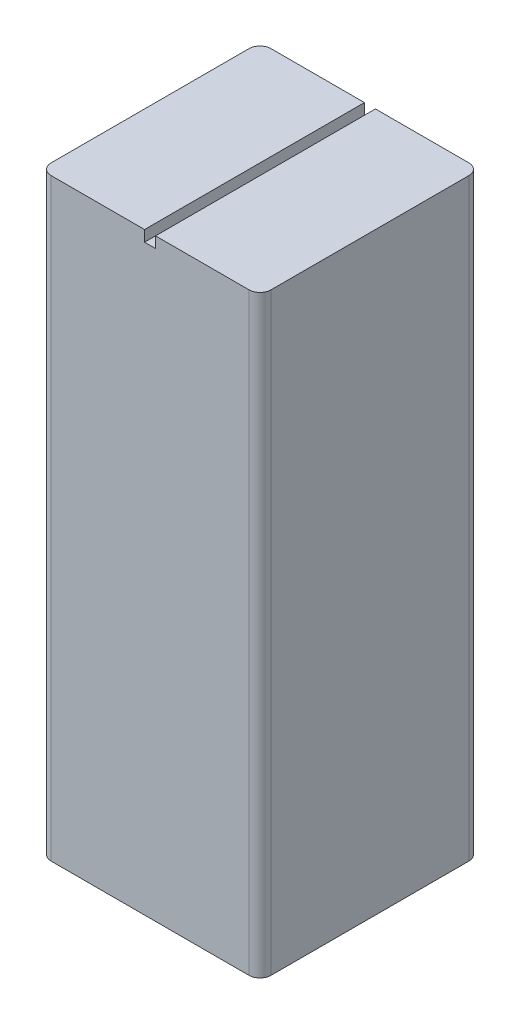
ISO-10303-21;
HEADER;
FILE_DESCRIPTION(('STEP AP214'),'2;1');
FILE_NAME('part.step','',(''),(''),'','','');
FILE_SCHEMA(('AUTOMOTIVE_DESIGN { 1 0 10303 214 1 1 1 1 }'));
ENDSEC;
DATA;
#1=APPLICATION_CONTEXT('core data for automotive mechanical design processes');
#2=APPLICATION_PROTOCOL_DEFINITION('international standard','automotive_design',2000,#1);
#3=PRODUCT_CONTEXT('',#1,'mechanical');
#4=PRODUCT('Part','Part','',(#3));
#5=PRODUCT_RELATED_PRODUCT_CATEGORY('part','',(#4));
#6=PRODUCT_DEFINITION_FORMATION('','',#4);
#7=PRODUCT_DEFINITION_CONTEXT('part definition',#1,'design');
#8=PRODUCT_DEFINITION('design','',#6,#7);
#9=PRODUCT_DEFINITION_SHAPE('','',#8);
#10=(LENGTH_UNIT() NAMED_UNIT(*) SI_UNIT(.MILLI.,.METRE.));
#11=(NAMED_UNIT(*) PLANE_ANGLE_UNIT() SI_UNIT($,.RADIAN.));
#12=(NAMED_UNIT(*) SI_UNIT($,.STERADIAN.) SOLID_ANGLE_UNIT());
#13=UNCERTAINTY_MEASURE_WITH_UNIT(LENGTH_MEASURE(1.E-05),#10,'distance_accuracy_value','');
#14=(GEOMETRIC_REPRESENTATION_CONTEXT(3) GLOBAL_UNCERTAINTY_ASSIGNED_CONTEXT((#13)) GLOBAL_UNIT_ASSIGNED_CONTEXT((#10,
#11,#12)) REPRESENTATION_CONTEXT('',''));
#15=CARTESIAN_POINT('',(0.,0.,0.));
#16=DIRECTION('',(0.,0.,1.));
#17=DIRECTION('',(1.,0.,0.));
#18=AXIS2_PLACEMENT_3D('',#15,#16,#17);
#19=CARTESIAN_POINT('',(0.,54.,0.));
#20=DIRECTION('',(0.,-1.,0.));
#21=DIRECTION('',(0.,0.,-1.));
#22=AXIS2_PLACEMENT_3D('',#19,#20,#21);
#23=PLANE('',#22);
#24=DIRECTION('',(1.,0.,0.));
#25=VECTOR('',#24,1.);
#26=CARTESIAN_POINT('',(0.,54.,0.));
#27=LINE('',#26,#25);
#28=CARTESIAN_POINT('',(1.,54.,0.));
#29=VERTEX_POINT('',#28);
#30=CARTESIAN_POINT('',(9.5,54.,0.));
#31=VERTEX_POINT('',#30);
#32=EDGE_CURVE('E170',#29,#31,#27,.T.);
#33=ORIENTED_EDGE('',*,*,#32,.T.);
#34=DIRECTION('',(0.,0.,1.));
#35=VECTOR('',#34,1.);
#36=CARTESIAN_POINT('',(9.5,54.,-20.));
#37=LINE('',#36,#35);
#38=CARTESIAN_POINT('',(9.5,54.,-20.));
#39=VERTEX_POINT('',#38);
#40=EDGE_CURVE('E133',#39,#31,#37,.T.);
#41=ORIENTED_EDGE('',*,*,#40,.F.);
#42=DIRECTION('',(-1.,0.,0.));
#43=VECTOR('',#42,1.);
#44=CARTESIAN_POINT('',(0.,54.,-20.));
#45=LINE('',#44,#43);
#46=CARTESIAN_POINT('',(0.999999999999997,54.,-20.));
#47=VERTEX_POINT('',#46);
#48=EDGE_CURVE('E62',#39,#47,#45,.T.);
#49=ORIENTED_EDGE('',*,*,#48,.T.);
#50=CARTESIAN_POINT('',(0.999999999999997,54.,-19.));
#51=DIRECTION('',(0.,-1.,0.));
#52=DIRECTION('',(0.,0.,-1.));
#53=AXIS2_PLACEMENT_3D('',#50,#51,#52);
#54=CIRCLE('',#53,1.);
#55=CARTESIAN_POINT('',(0.,54.,-19.));
#56=VERTEX_POINT('',#55);
#57=EDGE_CURVE('E207',#47,#56,#54,.F.);
#58=ORIENTED_EDGE('',*,*,#57,.T.);
#59=DIRECTION('',(0.,0.,1.));
#60=VECTOR('',#59,1.);
#61=CARTESIAN_POINT('',(0.,54.,0.));
#62=LINE('',#61,#60);
#63=CARTESIAN_POINT('',(0.,54.,-1.));
#64=VERTEX_POINT('',#63);
#65=EDGE_CURVE('E165',#56,#64,#62,.T.);
#66=ORIENTED_EDGE('',*,*,#65,.T.);
#67=CARTESIAN_POINT('',(1.,54.,-1.));
#68=DIRECTION('',(0.,-1.,0.));
#69=DIRECTION('',(0.,0.,-1.));
#70=AXIS2_PLACEMENT_3D('',#67,#68,#69);
#71=CIRCLE('',#70,1.);
#72=EDGE_CURVE('E211',#64,#29,#71,.F.);
#73=ORIENTED_EDGE('',*,*,#72,.T.);
#74=EDGE_LOOP('',(#33,#41,#49,#58,#66,#73));
#75=FACE_BOUND('',#74,.T.);
#76=ADVANCED_FACE('F39',(#75),#23,.F.);
#77=CARTESIAN_POINT('',(0.,54.,0.));
#78=DIRECTION('',(1.,0.,0.));
#79=DIRECTION('',(0.,0.,-1.));
#80=AXIS2_PLACEMENT_3D('',#77,#78,#79);
#81=PLANE('',#80);
#82=DIRECTION('',(0.,0.,1.));
#83=VECTOR('',#82,1.);
#84=CARTESIAN_POINT('',(0.,0.,0.));
#85=LINE('',#84,#83);
#86=CARTESIAN_POINT('',(0.,0.,-19.));
#87=VERTEX_POINT('',#86);
#88=CARTESIAN_POINT('',(0.,0.,-1.));
#89=VERTEX_POINT('',#88);
#90=EDGE_CURVE('E160',#87,#89,#85,.T.);
#91=ORIENTED_EDGE('',*,*,#90,.T.);
#92=DIRECTION('',(0.,-1.,0.));
#93=VECTOR('',#92,1.);
#94=CARTESIAN_POINT('',(0.,54.,-1.));
#95=LINE('',#94,#93);
#96=EDGE_CURVE('E218',#89,#64,#95,.F.);
#97=ORIENTED_EDGE('',*,*,#96,.T.);
#98=ORIENTED_EDGE('',*,*,#65,.F.);
#99=DIRECTION('',(0.,-1.,0.));
#100=VECTOR('',#99,1.);
#101=CARTESIAN_POINT('',(0.,54.,-19.));
#102=LINE('',#101,#100);
#103=EDGE_CURVE('E215',#56,#87,#102,.T.);
#104=ORIENTED_EDGE('',*,*,#103,.T.);
#105=EDGE_LOOP('',(#91,#97,#98,#104));
#106=FACE_BOUND('',#105,.T.);
#107=ADVANCED_FACE('F229',(#106),#81,.F.);
#108=CARTESIAN_POINT('',(0.,54.,0.));
#109=DIRECTION('',(0.,0.,-1.));
#110=DIRECTION('',(-1.,0.,0.));
#111=AXIS2_PLACEMENT_3D('',#108,#109,#110);
#112=PLANE('',#111);
#113=DIRECTION('',(1.,0.,0.));
#114=VECTOR('',#113,1.);
#115=CARTESIAN_POINT('',(9.5,53.,0.));
#116=LINE('',#115,#114);
#117=CARTESIAN_POINT('',(9.5,53.,0.));
#118=VERTEX_POINT('',#117);
#119=CARTESIAN_POINT('',(10.5,53.,0.));
#120=VERTEX_POINT('',#119);
#121=EDGE_CURVE('E144',#118,#120,#116,.T.);
#122=ORIENTED_EDGE('',*,*,#121,.F.);
#123=DIRECTION('',(0.,1.,0.));
#124=VECTOR('',#123,1.);
#125=CARTESIAN_POINT('',(9.5,53.,0.));
#126=LINE('',#125,#124);
#127=EDGE_CURVE('E128',#118,#31,#126,.T.);
#128=ORIENTED_EDGE('',*,*,#127,.T.);
#129=ORIENTED_EDGE('',*,*,#32,.F.);
#130=DIRECTION('',(0.,-1.,0.));
#131=VECTOR('',#130,1.);
#132=CARTESIAN_POINT('',(1.,54.,0.));
#133=LINE('',#132,#131);
#134=CARTESIAN_POINT('',(1.,0.,0.));
#135=VERTEX_POINT('',#134);
#136=EDGE_CURVE('E201',#29,#135,#133,.T.);
#137=ORIENTED_EDGE('',*,*,#136,.T.);
#138=DIRECTION('',(1.,0.,0.));
#139=VECTOR('',#138,1.);
#140=CARTESIAN_POINT('',(0.,0.,0.));
#141=LINE('',#140,#139);
#142=CARTESIAN_POINT('',(19.,0.,0.));
#143=VERTEX_POINT('',#142);
#144=EDGE_CURVE('E181',#135,#143,#141,.T.);
#145=ORIENTED_EDGE('',*,*,#144,.T.);
#146=DIRECTION('',(0.,-1.,0.));
#147=VECTOR('',#146,1.);
#148=CARTESIAN_POINT('',(19.,54.,0.));
#149=LINE('',#148,#147);
#150=CARTESIAN_POINT('',(19.,54.,0.));
#151=VERTEX_POINT('',#150);
#152=EDGE_CURVE('E204',#143,#151,#149,.F.);
#153=ORIENTED_EDGE('',*,*,#152,.T.);
#154=CARTESIAN_POINT('',(10.5,54.,0.));
#155=VERTEX_POINT('',#154);
#156=EDGE_CURVE('E168',#155,#151,#27,.T.);
#157=ORIENTED_EDGE('',*,*,#156,.F.);
#158=DIRECTION('',(0.,1.,0.));
#159=VECTOR('',#158,1.);
#160=CARTESIAN_POINT('',(10.5,53.,0.));
#161=LINE('',#160,#159);
#162=EDGE_CURVE('E54',#120,#155,#161,.T.);
#163=ORIENTED_EDGE('',*,*,#162,.F.);
#164=EDGE_LOOP('',(#122,#128,#129,#137,#145,#153,#157,#163));
#165=FACE_BOUND('',#164,.T.);
#166=ADVANCED_FACE('F149',(#165),#112,.F.);
#167=CARTESIAN_POINT('',(20.,54.,0.));
#168=DIRECTION('',(-1.,0.,0.));
#169=DIRECTION('',(0.,0.,1.));
#170=AXIS2_PLACEMENT_3D('',#167,#168,#169);
#171=PLANE('',#170);
#172=DIRECTION('',(0.,0.,-1.));
#173=VECTOR('',#172,1.);
#174=CARTESIAN_POINT('',(20.,54.,0.));
#175=LINE('',#174,#173);
#176=CARTESIAN_POINT('',(20.,54.,-1.));
#177=VERTEX_POINT('',#176);
#178=CARTESIAN_POINT('',(20.,54.,-19.));
#179=VERTEX_POINT('',#178);
#180=EDGE_CURVE('E172',#177,#179,#175,.T.);
#181=ORIENTED_EDGE('',*,*,#180,.F.);
#182=DIRECTION('',(0.,-1.,0.));
#183=VECTOR('',#182,1.);
#184=CARTESIAN_POINT('',(20.,54.,-1.));
#185=LINE('',#184,#183);
#186=CARTESIAN_POINT('',(20.,0.,-1.));
#187=VERTEX_POINT('',#186);
#188=EDGE_CURVE('E190',#177,#187,#185,.T.);
#189=ORIENTED_EDGE('',*,*,#188,.T.);
#190=DIRECTION('',(0.,0.,-1.));
#191=VECTOR('',#190,1.);
#192=CARTESIAN_POINT('',(20.,0.,0.));
#193=LINE('',#192,#191);
#194=CARTESIAN_POINT('',(20.,0.,-19.));
#195=VERTEX_POINT('',#194);
#196=EDGE_CURVE('E184',#187,#195,#193,.T.);
#197=ORIENTED_EDGE('',*,*,#196,.T.);
#198=DIRECTION('',(0.,-1.,0.));
#199=VECTOR('',#198,1.);
#200=CARTESIAN_POINT('',(20.,54.,-19.));
#201=LINE('',#200,#199);
#202=EDGE_CURVE('E178',#195,#179,#201,.F.);
#203=ORIENTED_EDGE('',*,*,#202,.T.);
#204=EDGE_LOOP('',(#181,#189,#197,#203));
#205=FACE_BOUND('',#204,.T.);
#206=ADVANCED_FACE('F246',(#205),#171,.F.);
#207=CARTESIAN_POINT('',(0.,54.,-20.));
#208=DIRECTION('',(0.,0.,1.));
#209=DIRECTION('',(1.,0.,0.));
#210=AXIS2_PLACEMENT_3D('',#207,#208,#209);
#211=PLANE('',#210);
#212=ORIENTED_EDGE('',*,*,#48,.F.);
#213=DIRECTION('',(0.,1.,0.));
#214=VECTOR('',#213,1.);
#215=CARTESIAN_POINT('',(9.5,53.,-20.));
#216=LINE('',#215,#214);
#217=CARTESIAN_POINT('',(9.5,53.,-20.));
#218=VERTEX_POINT('',#217);
#219=EDGE_CURVE('E158',#218,#39,#216,.T.);
#220=ORIENTED_EDGE('',*,*,#219,.F.);
#221=DIRECTION('',(-1.,0.,0.));
#222=VECTOR('',#221,1.);
#223=CARTESIAN_POINT('',(9.5,53.,-20.));
#224=LINE('',#223,#222);
#225=CARTESIAN_POINT('',(10.5,53.,-20.));
#226=VERTEX_POINT('',#225);
#227=EDGE_CURVE('E138',#226,#218,#224,.T.);
#228=ORIENTED_EDGE('',*,*,#227,.F.);
#229=DIRECTION('',(0.,1.,0.));
#230=VECTOR('',#229,1.);
#231=CARTESIAN_POINT('',(10.5,53.,-20.));
#232=LINE('',#231,#230);
#233=CARTESIAN_POINT('',(10.5,54.,-20.));
#234=VERTEX_POINT('',#233);
#235=EDGE_CURVE('E161',#226,#234,#232,.T.);
#236=ORIENTED_EDGE('',*,*,#235,.T.);
#237=CARTESIAN_POINT('',(19.,54.,-20.));
#238=VERTEX_POINT('',#237);
#239=EDGE_CURVE('E175',#238,#234,#45,.T.);
#240=ORIENTED_EDGE('',*,*,#239,.F.);
#241=DIRECTION('',(0.,-1.,0.));
#242=VECTOR('',#241,1.);
#243=CARTESIAN_POINT('',(19.,54.,-20.));
#244=LINE('',#243,#242);
#245=CARTESIAN_POINT('',(19.,0.,-20.));
#246=VERTEX_POINT('',#245);
#247=EDGE_CURVE('E11',#238,#246,#244,.T.);
#248=ORIENTED_EDGE('',*,*,#247,.T.);
#249=DIRECTION('',(-1.,0.,0.));
#250=VECTOR('',#249,1.);
#251=CARTESIAN_POINT('',(0.,0.,-20.));
#252=LINE('',#251,#250);
#253=CARTESIAN_POINT('',(0.999999999999997,0.,-20.));
#254=VERTEX_POINT('',#253);
#255=EDGE_CURVE('E169',#246,#254,#252,.T.);
#256=ORIENTED_EDGE('',*,*,#255,.T.);
#257=DIRECTION('',(0.,-1.,0.));
#258=VECTOR('',#257,1.);
#259=CARTESIAN_POINT('',(0.999999999999997,54.,-20.));
#260=LINE('',#259,#258);
#261=EDGE_CURVE('E47',#254,#47,#260,.F.);
#262=ORIENTED_EDGE('',*,*,#261,.T.);
#263=EDGE_LOOP('',(#212,#220,#228,#236,#240,#248,#256,#262));
#264=FACE_BOUND('',#263,.T.);
#265=ADVANCED_FACE('F222',(#264),#211,.F.);
#266=ORIENTED_EDGE('',*,*,#239,.T.);
#267=DIRECTION('',(0.,0.,-1.));
#268=VECTOR('',#267,1.);
#269=CARTESIAN_POINT('',(10.5,54.,-20.));
#270=LINE('',#269,#268);
#271=EDGE_CURVE('E147',#155,#234,#270,.T.);
#272=ORIENTED_EDGE('',*,*,#271,.F.);
#273=ORIENTED_EDGE('',*,*,#156,.T.);
#274=CARTESIAN_POINT('',(19.,54.,-1.));
#275=DIRECTION('',(0.,-1.,0.));
#276=DIRECTION('',(0.,0.,-1.));
#277=AXIS2_PLACEMENT_3D('',#274,#275,#276);
#278=CIRCLE('',#277,1.);
#279=EDGE_CURVE('E213',#151,#177,#278,.F.);
#280=ORIENTED_EDGE('',*,*,#279,.T.);
#281=ORIENTED_EDGE('',*,*,#180,.T.);
#282=CARTESIAN_POINT('',(19.,54.,-19.));
#283=DIRECTION('',(0.,-1.,0.));
#284=DIRECTION('',(0.,0.,-1.));
#285=AXIS2_PLACEMENT_3D('',#282,#283,#284);
#286=CIRCLE('',#285,1.);
#287=EDGE_CURVE('E209',#179,#238,#286,.F.);
#288=ORIENTED_EDGE('',*,*,#287,.T.);
#289=EDGE_LOOP('',(#266,#272,#273,#280,#281,#288));
#290=FACE_BOUND('',#289,.T.);
#291=ADVANCED_FACE('F250',(#290),#23,.F.);
#292=CARTESIAN_POINT('',(0.,0.,0.));
#293=DIRECTION('',(0.,-1.,0.));
#294=DIRECTION('',(0.,0.,-1.));
#295=AXIS2_PLACEMENT_3D('',#292,#293,#294);
#296=PLANE('',#295);
#297=ORIENTED_EDGE('',*,*,#196,.F.);
#298=CARTESIAN_POINT('',(19.,0.,-1.));
#299=DIRECTION('',(0.,-1.,0.));
#300=DIRECTION('',(0.,0.,-1.));
#301=AXIS2_PLACEMENT_3D('',#298,#299,#300);
#302=CIRCLE('',#301,1.);
#303=EDGE_CURVE('E199',#187,#143,#302,.T.);
#304=ORIENTED_EDGE('',*,*,#303,.T.);
#305=ORIENTED_EDGE('',*,*,#144,.F.);
#306=CARTESIAN_POINT('',(1.,0.,-1.));
#307=DIRECTION('',(0.,-1.,0.));
#308=DIRECTION('',(0.,0.,-1.));
#309=AXIS2_PLACEMENT_3D('',#306,#307,#308);
#310=CIRCLE('',#309,1.);
#311=EDGE_CURVE('E197',#135,#89,#310,.T.);
#312=ORIENTED_EDGE('',*,*,#311,.T.);
#313=ORIENTED_EDGE('',*,*,#90,.F.);
#314=CARTESIAN_POINT('',(0.999999999999997,0.,-19.));
#315=DIRECTION('',(0.,-1.,0.));
#316=DIRECTION('',(0.,0.,-1.));
#317=AXIS2_PLACEMENT_3D('',#314,#315,#316);
#318=CIRCLE('',#317,1.);
#319=EDGE_CURVE('E193',#87,#254,#318,.T.);
#320=ORIENTED_EDGE('',*,*,#319,.T.);
#321=ORIENTED_EDGE('',*,*,#255,.F.);
#322=CARTESIAN_POINT('',(19.,0.,-19.));
#323=DIRECTION('',(0.,-1.,0.));
#324=DIRECTION('',(0.,0.,-1.));
#325=AXIS2_PLACEMENT_3D('',#322,#323,#324);
#326=CIRCLE('',#325,1.);
#327=EDGE_CURVE('E195',#246,#195,#326,.T.);
#328=ORIENTED_EDGE('',*,*,#327,.T.);
#329=EDGE_LOOP('',(#297,#304,#305,#312,#313,#320,#321,#328));
#330=FACE_BOUND('',#329,.T.);
#331=ADVANCED_FACE('F239',(#330),#296,.T.);
#332=CARTESIAN_POINT('',(19.,54.,-1.));
#333=DIRECTION('',(0.,-1.,0.));
#334=DIRECTION('',(0.,0.,-1.));
#335=AXIS2_PLACEMENT_3D('',#332,#333,#334);
#336=CYLINDRICAL_SURFACE('',#335,1.);
#337=ORIENTED_EDGE('',*,*,#279,.F.);
#338=ORIENTED_EDGE('',*,*,#152,.F.);
#339=ORIENTED_EDGE('',*,*,#303,.F.);
#340=ORIENTED_EDGE('',*,*,#188,.F.);
#341=EDGE_LOOP('',(#337,#338,#339,#340));
#342=FACE_BOUND('',#341,.T.);
#343=ADVANCED_FACE('F243',(#342),#336,.T.);
#344=CARTESIAN_POINT('',(1.,54.,-1.));
#345=DIRECTION('',(0.,-1.,0.));
#346=DIRECTION('',(0.,0.,-1.));
#347=AXIS2_PLACEMENT_3D('',#344,#345,#346);
#348=CYLINDRICAL_SURFACE('',#347,1.);
#349=ORIENTED_EDGE('',*,*,#72,.F.);
#350=ORIENTED_EDGE('',*,*,#96,.F.);
#351=ORIENTED_EDGE('',*,*,#311,.F.);
#352=ORIENTED_EDGE('',*,*,#136,.F.);
#353=EDGE_LOOP('',(#349,#350,#351,#352));
#354=FACE_BOUND('',#353,.T.);
#355=ADVANCED_FACE('F233',(#354),#348,.T.);
#356=CARTESIAN_POINT('',(19.,54.,-19.));
#357=DIRECTION('',(0.,-1.,0.));
#358=DIRECTION('',(0.,0.,-1.));
#359=AXIS2_PLACEMENT_3D('',#356,#357,#358);
#360=CYLINDRICAL_SURFACE('',#359,1.);
#361=ORIENTED_EDGE('',*,*,#287,.F.);
#362=ORIENTED_EDGE('',*,*,#202,.F.);
#363=ORIENTED_EDGE('',*,*,#327,.F.);
#364=ORIENTED_EDGE('',*,*,#247,.F.);
#365=EDGE_LOOP('',(#361,#362,#363,#364));
#366=FACE_BOUND('',#365,.T.);
#367=ADVANCED_FACE('F254',(#366),#360,.T.);
#368=CARTESIAN_POINT('',(0.999999999999997,54.,-19.));
#369=DIRECTION('',(0.,-1.,0.));
#370=DIRECTION('',(0.,0.,-1.));
#371=AXIS2_PLACEMENT_3D('',#368,#369,#370);
#372=CYLINDRICAL_SURFACE('',#371,1.);
#373=ORIENTED_EDGE('',*,*,#57,.F.);
#374=ORIENTED_EDGE('',*,*,#261,.F.);
#375=ORIENTED_EDGE('',*,*,#319,.F.);
#376=ORIENTED_EDGE('',*,*,#103,.F.);
#377=EDGE_LOOP('',(#373,#374,#375,#376));
#378=FACE_BOUND('',#377,.T.);
#379=ADVANCED_FACE('F41',(#378),#372,.T.);
#380=CARTESIAN_POINT('',(9.5,53.,-20.));
#381=DIRECTION('',(-1.,0.,0.));
#382=DIRECTION('',(0.,0.,1.));
#383=AXIS2_PLACEMENT_3D('',#380,#381,#382);
#384=PLANE('',#383);
#385=ORIENTED_EDGE('',*,*,#40,.T.);
#386=ORIENTED_EDGE('',*,*,#127,.F.);
#387=DIRECTION('',(0.,0.,1.));
#388=VECTOR('',#387,1.);
#389=CARTESIAN_POINT('',(9.5,53.,-20.));
#390=LINE('',#389,#388);
#391=EDGE_CURVE('E131',#218,#118,#390,.T.);
#392=ORIENTED_EDGE('',*,*,#391,.F.);
#393=ORIENTED_EDGE('',*,*,#219,.T.);
#394=EDGE_LOOP('',(#385,#386,#392,#393));
#395=FACE_BOUND('',#394,.T.);
#396=ADVANCED_FACE('F130',(#395),#384,.F.);
#397=CARTESIAN_POINT('',(10.5,53.,-20.));
#398=DIRECTION('',(1.,0.,0.));
#399=DIRECTION('',(0.,0.,-1.));
#400=AXIS2_PLACEMENT_3D('',#397,#398,#399);
#401=PLANE('',#400);
#402=ORIENTED_EDGE('',*,*,#271,.T.);
#403=ORIENTED_EDGE('',*,*,#235,.F.);
#404=DIRECTION('',(0.,0.,-1.));
#405=VECTOR('',#404,1.);
#406=CARTESIAN_POINT('',(10.5,53.,-20.));
#407=LINE('',#406,#405);
#408=EDGE_CURVE('E151',#120,#226,#407,.T.);
#409=ORIENTED_EDGE('',*,*,#408,.F.);
#410=ORIENTED_EDGE('',*,*,#162,.T.);
#411=EDGE_LOOP('',(#402,#403,#409,#410));
#412=FACE_BOUND('',#411,.T.);
#413=ADVANCED_FACE('F255',(#412),#401,.F.);
#414=CARTESIAN_POINT('',(0.,53.,0.));
#415=DIRECTION('',(0.,1.,0.));
#416=DIRECTION('',(0.,0.,1.));
#417=AXIS2_PLACEMENT_3D('',#414,#415,#416);
#418=PLANE('',#417);
#419=ORIENTED_EDGE('',*,*,#391,.T.);
#420=ORIENTED_EDGE('',*,*,#121,.T.);
#421=ORIENTED_EDGE('',*,*,#408,.T.);
#422=ORIENTED_EDGE('',*,*,#227,.T.);
#423=EDGE_LOOP('',(#419,#420,#421,#422));
#424=FACE_BOUND('',#423,.T.);
#425=ADVANCED_FACE('F142',(#424),#418,.T.);
#426=CLOSED_SHELL('',(#76,#107,#166,#206,#265,#291,#331,#343,#355,#367,#379,#396,#413,#425));
#427=MANIFOLD_SOLID_BREP('B2',#426);
#428=ADVANCED_BREP_SHAPE_REPRESENTATION('',(#18,#427),#14);
#429=SHAPE_DEFINITION_REPRESENTATION(#9,#428);
ENDSEC;
END-ISO-10303-21;
